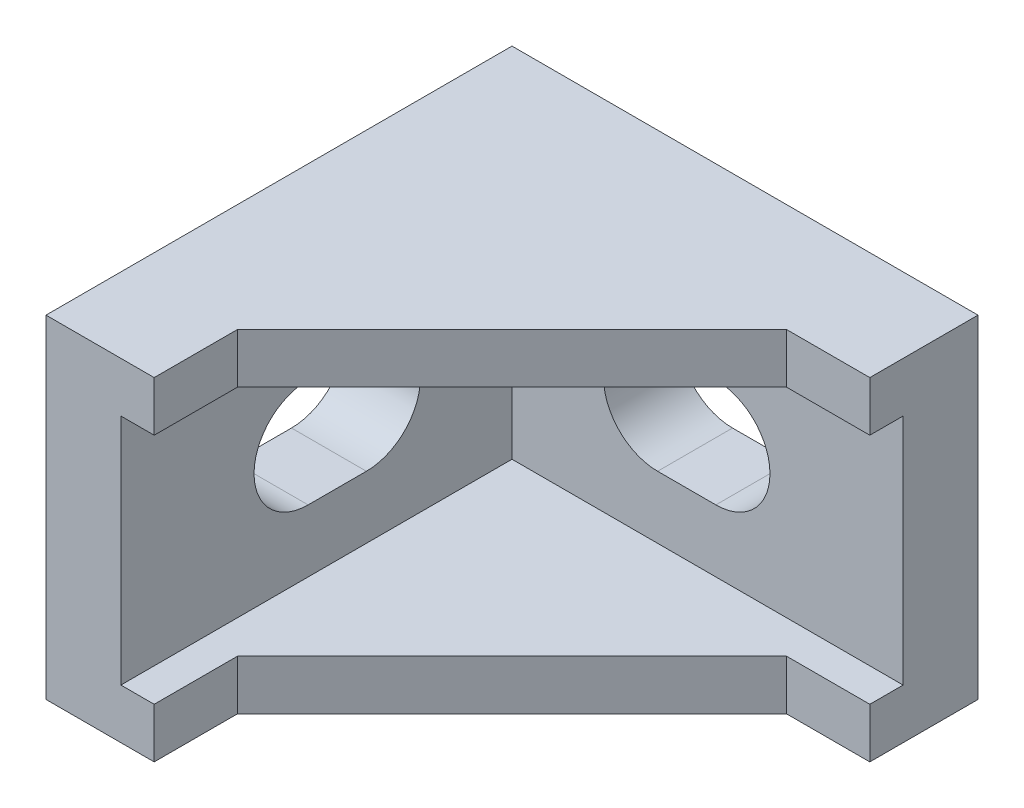
ISO-10303-21;
HEADER;
FILE_DESCRIPTION(('STEP AP214'),'2;1');
FILE_NAME('part.step','',(''),(''),'','','');
FILE_SCHEMA(('AUTOMOTIVE_DESIGN { 1 0 10303 214 1 1 1 1 }'));
ENDSEC;
DATA;
#1=APPLICATION_CONTEXT('core data for automotive mechanical design processes');
#2=APPLICATION_PROTOCOL_DEFINITION('international standard','automotive_design',2000,#1);
#3=PRODUCT_CONTEXT('',#1,'mechanical');
#4=PRODUCT('Part','Part','',(#3));
#5=PRODUCT_RELATED_PRODUCT_CATEGORY('part','',(#4));
#6=PRODUCT_DEFINITION_FORMATION('','',#4);
#7=PRODUCT_DEFINITION_CONTEXT('part definition',#1,'design');
#8=PRODUCT_DEFINITION('design','',#6,#7);
#9=PRODUCT_DEFINITION_SHAPE('','',#8);
#10=(LENGTH_UNIT() NAMED_UNIT(*) SI_UNIT(.MILLI.,.METRE.));
#11=(NAMED_UNIT(*) PLANE_ANGLE_UNIT() SI_UNIT($,.RADIAN.));
#12=(NAMED_UNIT(*) SI_UNIT($,.STERADIAN.) SOLID_ANGLE_UNIT());
#13=UNCERTAINTY_MEASURE_WITH_UNIT(LENGTH_MEASURE(1.E-05),#10,'distance_accuracy_value','');
#14=(GEOMETRIC_REPRESENTATION_CONTEXT(3) GLOBAL_UNCERTAINTY_ASSIGNED_CONTEXT((#13)) GLOBAL_UNIT_ASSIGNED_CONTEXT((#10,
#11,#12)) REPRESENTATION_CONTEXT('',''));
#15=CARTESIAN_POINT('',(0.,0.,0.));
#16=DIRECTION('',(0.,0.,1.));
#17=DIRECTION('',(1.,0.,0.));
#18=AXIS2_PLACEMENT_3D('',#15,#16,#17);
#19=CARTESIAN_POINT('',(0.,0.,4.5));
#20=DIRECTION('',(0.,0.,-1.));
#21=DIRECTION('',(-1.,0.,0.));
#22=AXIS2_PLACEMENT_3D('',#19,#20,#21);
#23=PLANE('',#22);
#24=CARTESIAN_POINT('',(-0.750000000000005,0.,4.5));
#25=DIRECTION('',(0.,0.,1.));
#26=DIRECTION('',(1.,0.,0.));
#27=AXIS2_PLACEMENT_3D('',#24,#25,#26);
#28=CIRCLE('',#27,3.25);
#29=CARTESIAN_POINT('',(-0.750000000000007,3.25,4.5));
#30=VERTEX_POINT('',#29);
#31=CARTESIAN_POINT('',(-0.750000000000006,-3.25,4.5));
#32=VERTEX_POINT('',#31);
#33=EDGE_CURVE('E245',#30,#32,#28,.T.);
#34=ORIENTED_EDGE('',*,*,#33,.F.);
#35=DIRECTION('',(-1.,0.,0.));
#36=VECTOR('',#35,1.);
#37=CARTESIAN_POINT('',(-0.750000000000007,3.25,4.5));
#38=LINE('',#37,#36);
#39=CARTESIAN_POINT('',(2.75,3.25,4.5));
#40=VERTEX_POINT('',#39);
#41=EDGE_CURVE('E253',#40,#30,#38,.T.);
#42=ORIENTED_EDGE('',*,*,#41,.F.);
#43=CARTESIAN_POINT('',(2.75,0.,4.5));
#44=DIRECTION('',(0.,0.,1.));
#45=DIRECTION('',(1.,0.,0.));
#46=AXIS2_PLACEMENT_3D('',#43,#44,#45);
#47=CIRCLE('',#46,3.25);
#48=CARTESIAN_POINT('',(2.75,-3.25,4.5));
#49=VERTEX_POINT('',#48);
#50=EDGE_CURVE('E250',#49,#40,#47,.T.);
#51=ORIENTED_EDGE('',*,*,#50,.F.);
#52=DIRECTION('',(1.,0.,0.));
#53=VECTOR('',#52,1.);
#54=CARTESIAN_POINT('',(-0.750000000000006,-3.25,4.5));
#55=LINE('',#54,#53);
#56=EDGE_CURVE('E247',#32,#49,#55,.T.);
#57=ORIENTED_EDGE('',*,*,#56,.F.);
#58=EDGE_LOOP('',(#34,#42,#51,#57));
#59=FACE_BOUND('',#58,.T.);
#60=DIRECTION('',(1.,0.,0.));
#61=VECTOR('',#60,1.);
#62=CARTESIAN_POINT('',(-9.50000000000001,7.00000000000001,4.5));
#63=LINE('',#62,#61);
#64=CARTESIAN_POINT('',(-9.50000000000001,7.00000000000001,4.5));
#65=VERTEX_POINT('',#64);
#66=CARTESIAN_POINT('',(14.,7.00000000000001,4.5));
#67=VERTEX_POINT('',#66);
#68=EDGE_CURVE('E198',#65,#67,#63,.T.);
#69=ORIENTED_EDGE('',*,*,#68,.F.);
#70=DIRECTION('',(0.,-1.,0.));
#71=VECTOR('',#70,1.);
#72=CARTESIAN_POINT('',(-9.50000000000001,12.,4.5));
#73=LINE('',#72,#71);
#74=CARTESIAN_POINT('',(-9.50000000000001,-7.00000000000001,4.5));
#75=VERTEX_POINT('',#74);
#76=EDGE_CURVE('E185',#65,#75,#73,.T.);
#77=ORIENTED_EDGE('',*,*,#76,.T.);
#78=DIRECTION('',(1.,0.,0.));
#79=VECTOR('',#78,1.);
#80=CARTESIAN_POINT('',(-9.50000000000001,-7.00000000000001,4.5));
#81=LINE('',#80,#79);
#82=CARTESIAN_POINT('',(14.,-7.00000000000001,4.5));
#83=VERTEX_POINT('',#82);
#84=EDGE_CURVE('E227',#75,#83,#81,.T.);
#85=ORIENTED_EDGE('',*,*,#84,.T.);
#86=DIRECTION('',(0.,1.,0.));
#87=VECTOR('',#86,1.);
#88=CARTESIAN_POINT('',(14.,-10.,4.5));
#89=LINE('',#88,#87);
#90=EDGE_CURVE('E48',#83,#67,#89,.T.);
#91=ORIENTED_EDGE('',*,*,#90,.T.);
#92=EDGE_LOOP('',(#69,#77,#85,#91));
#93=FACE_BOUND('',#92,.T.);
#94=ADVANCED_FACE('F33',(#59,#93),#23,.F.);
#95=CARTESIAN_POINT('',(0.,0.,0.));
#96=DIRECTION('',(0.,0.,-1.));
#97=DIRECTION('',(-1.,0.,0.));
#98=AXIS2_PLACEMENT_3D('',#95,#96,#97);
#99=PLANE('',#98);
#100=DIRECTION('',(0.,1.,0.));
#101=VECTOR('',#100,1.);
#102=CARTESIAN_POINT('',(14.,-10.,0.));
#103=LINE('',#102,#101);
#104=CARTESIAN_POINT('',(14.,-10.,0.));
#105=VERTEX_POINT('',#104);
#106=CARTESIAN_POINT('',(14.,10.,0.));
#107=VERTEX_POINT('',#106);
#108=EDGE_CURVE('E275',#105,#107,#103,.T.);
#109=ORIENTED_EDGE('',*,*,#108,.F.);
#110=DIRECTION('',(1.,0.,0.));
#111=VECTOR('',#110,1.);
#112=CARTESIAN_POINT('',(-14.,-10.,0.));
#113=LINE('',#112,#111);
#114=CARTESIAN_POINT('',(-14.,-10.,0.));
#115=VERTEX_POINT('',#114);
#116=EDGE_CURVE('E277',#115,#105,#113,.T.);
#117=ORIENTED_EDGE('',*,*,#116,.F.);
#118=DIRECTION('',(0.,-1.,0.));
#119=VECTOR('',#118,1.);
#120=CARTESIAN_POINT('',(-14.,-10.,0.));
#121=LINE('',#120,#119);
#122=CARTESIAN_POINT('',(-14.,10.,0.));
#123=VERTEX_POINT('',#122);
#124=EDGE_CURVE('E294',#123,#115,#121,.T.);
#125=ORIENTED_EDGE('',*,*,#124,.F.);
#126=DIRECTION('',(-1.,0.,0.));
#127=VECTOR('',#126,1.);
#128=CARTESIAN_POINT('',(-14.,10.,0.));
#129=LINE('',#128,#127);
#130=EDGE_CURVE('E280',#107,#123,#129,.T.);
#131=ORIENTED_EDGE('',*,*,#130,.F.);
#132=EDGE_LOOP('',(#109,#117,#125,#131));
#133=FACE_BOUND('',#132,.T.);
#134=DIRECTION('',(-1.,0.,0.));
#135=VECTOR('',#134,1.);
#136=CARTESIAN_POINT('',(-0.750000000000007,3.25,0.));
#137=LINE('',#136,#135);
#138=CARTESIAN_POINT('',(2.75,3.25,0.));
#139=VERTEX_POINT('',#138);
#140=CARTESIAN_POINT('',(-0.750000000000007,3.25,0.));
#141=VERTEX_POINT('',#140);
#142=EDGE_CURVE('E248',#139,#141,#137,.T.);
#143=ORIENTED_EDGE('',*,*,#142,.T.);
#144=CARTESIAN_POINT('',(-0.750000000000005,0.,0.));
#145=DIRECTION('',(0.,0.,1.));
#146=DIRECTION('',(1.,0.,0.));
#147=AXIS2_PLACEMENT_3D('',#144,#145,#146);
#148=CIRCLE('',#147,3.25);
#149=CARTESIAN_POINT('',(-0.750000000000006,-3.25,0.));
#150=VERTEX_POINT('',#149);
#151=EDGE_CURVE('E242',#141,#150,#148,.T.);
#152=ORIENTED_EDGE('',*,*,#151,.T.);
#153=DIRECTION('',(1.,0.,0.));
#154=VECTOR('',#153,1.);
#155=CARTESIAN_POINT('',(-0.750000000000006,-3.25,0.));
#156=LINE('',#155,#154);
#157=CARTESIAN_POINT('',(2.75,-3.25,0.));
#158=VERTEX_POINT('',#157);
#159=EDGE_CURVE('E258',#150,#158,#156,.T.);
#160=ORIENTED_EDGE('',*,*,#159,.T.);
#161=CARTESIAN_POINT('',(2.75,0.,0.));
#162=DIRECTION('',(0.,0.,1.));
#163=DIRECTION('',(1.,0.,0.));
#164=AXIS2_PLACEMENT_3D('',#161,#162,#163);
#165=CIRCLE('',#164,3.25);
#166=EDGE_CURVE('E261',#158,#139,#165,.T.);
#167=ORIENTED_EDGE('',*,*,#166,.T.);
#168=EDGE_LOOP('',(#143,#152,#160,#167));
#169=FACE_BOUND('',#168,.T.);
#170=ADVANCED_FACE('F290',(#133,#169),#99,.T.);
#171=CARTESIAN_POINT('',(14.,-10.,4.5));
#172=DIRECTION('',(-1.,0.,0.));
#173=DIRECTION('',(0.,-1.,0.));
#174=AXIS2_PLACEMENT_3D('',#171,#172,#173);
#175=PLANE('',#174);
#176=ORIENTED_EDGE('',*,*,#108,.T.);
#177=DIRECTION('',(0.,0.,-1.));
#178=VECTOR('',#177,1.);
#179=CARTESIAN_POINT('',(14.,10.,4.5));
#180=LINE('',#179,#178);
#181=CARTESIAN_POINT('',(14.,10.,6.5));
#182=VERTEX_POINT('',#181);
#183=EDGE_CURVE('E11',#182,#107,#180,.T.);
#184=ORIENTED_EDGE('',*,*,#183,.F.);
#185=DIRECTION('',(0.,1.,0.));
#186=VECTOR('',#185,1.);
#187=CARTESIAN_POINT('',(14.,7.00000000000001,6.5));
#188=LINE('',#187,#186);
#189=CARTESIAN_POINT('',(14.,7.00000000000001,6.5));
#190=VERTEX_POINT('',#189);
#191=EDGE_CURVE('E221',#190,#182,#188,.T.);
#192=ORIENTED_EDGE('',*,*,#191,.F.);
#193=DIRECTION('',(0.,0.,1.));
#194=VECTOR('',#193,1.);
#195=CARTESIAN_POINT('',(14.,7.00000000000001,4.5));
#196=LINE('',#195,#194);
#197=EDGE_CURVE('E217',#67,#190,#196,.T.);
#198=ORIENTED_EDGE('',*,*,#197,.F.);
#199=ORIENTED_EDGE('',*,*,#90,.F.);
#200=DIRECTION('',(0.,0.,1.));
#201=VECTOR('',#200,1.);
#202=CARTESIAN_POINT('',(14.,-7.00000000000001,4.5));
#203=LINE('',#202,#201);
#204=CARTESIAN_POINT('',(14.,-7.00000000000001,6.5));
#205=VERTEX_POINT('',#204);
#206=EDGE_CURVE('E56',#83,#205,#203,.T.);
#207=ORIENTED_EDGE('',*,*,#206,.T.);
#208=DIRECTION('',(0.,-1.,0.));
#209=VECTOR('',#208,1.);
#210=CARTESIAN_POINT('',(14.,-7.00000000000001,6.5));
#211=LINE('',#210,#209);
#212=CARTESIAN_POINT('',(14.,-10.,6.5));
#213=VERTEX_POINT('',#212);
#214=EDGE_CURVE('E236',#205,#213,#211,.T.);
#215=ORIENTED_EDGE('',*,*,#214,.T.);
#216=DIRECTION('',(0.,0.,-1.));
#217=VECTOR('',#216,1.);
#218=CARTESIAN_POINT('',(14.,-10.,4.5));
#219=LINE('',#218,#217);
#220=EDGE_CURVE('E41',#213,#105,#219,.T.);
#221=ORIENTED_EDGE('',*,*,#220,.T.);
#222=EDGE_LOOP('',(#176,#184,#192,#198,#199,#207,#215,#221));
#223=FACE_BOUND('',#222,.T.);
#224=ADVANCED_FACE('F35',(#223),#175,.F.);
#225=CARTESIAN_POINT('',(-14.,10.,4.5));
#226=DIRECTION('',(0.,-1.,0.));
#227=DIRECTION('',(1.,0.,0.));
#228=AXIS2_PLACEMENT_3D('',#225,#226,#227);
#229=PLANE('',#228);
#230=ORIENTED_EDGE('',*,*,#130,.T.);
#231=DIRECTION('',(0.,0.,-1.));
#232=VECTOR('',#231,1.);
#233=CARTESIAN_POINT('',(-14.,10.,0.));
#234=LINE('',#233,#232);
#235=CARTESIAN_POINT('',(-14.,10.,28.));
#236=VERTEX_POINT('',#235);
#237=EDGE_CURVE('E377',#236,#123,#234,.T.);
#238=ORIENTED_EDGE('',*,*,#237,.F.);
#239=DIRECTION('',(-1.,0.,0.));
#240=VECTOR('',#239,1.);
#241=CARTESIAN_POINT('',(-9.50000000000002,10.,28.));
#242=LINE('',#241,#240);
#243=CARTESIAN_POINT('',(-7.50000000000002,10.,28.));
#244=VERTEX_POINT('',#243);
#245=EDGE_CURVE('E213',#244,#236,#242,.T.);
#246=ORIENTED_EDGE('',*,*,#245,.F.);
#247=DIRECTION('',(0.,0.,-1.));
#248=VECTOR('',#247,1.);
#249=CARTESIAN_POINT('',(-7.50000000000002,10.,28.));
#250=LINE('',#249,#248);
#251=CARTESIAN_POINT('',(-7.50000000000002,10.,23.));
#252=VERTEX_POINT('',#251);
#253=EDGE_CURVE('E203',#244,#252,#250,.T.);
#254=ORIENTED_EDGE('',*,*,#253,.T.);
#255=DIRECTION('',(-0.707106781186556,0.,0.707106781186539));
#256=VECTOR('',#255,1.);
#257=CARTESIAN_POINT('',(8.99999999999999,10.,6.5));
#258=LINE('',#257,#256);
#259=CARTESIAN_POINT('',(8.99999999999999,10.,6.5));
#260=VERTEX_POINT('',#259);
#261=EDGE_CURVE('E210',#260,#252,#258,.T.);
#262=ORIENTED_EDGE('',*,*,#261,.F.);
#263=DIRECTION('',(-1.,0.,0.));
#264=VECTOR('',#263,1.);
#265=CARTESIAN_POINT('',(14.,10.,6.5));
#266=LINE('',#265,#264);
#267=EDGE_CURVE('E206',#182,#260,#266,.T.);
#268=ORIENTED_EDGE('',*,*,#267,.F.);
#269=ORIENTED_EDGE('',*,*,#183,.T.);
#270=EDGE_LOOP('',(#230,#238,#246,#254,#262,#268,#269));
#271=FACE_BOUND('',#270,.T.);
#272=ADVANCED_FACE('F298',(#271),#229,.F.);
#273=CARTESIAN_POINT('',(-14.,-10.,4.5));
#274=DIRECTION('',(0.,1.,0.));
#275=DIRECTION('',(0.,0.,1.));
#276=AXIS2_PLACEMENT_3D('',#273,#274,#275);
#277=PLANE('',#276);
#278=ORIENTED_EDGE('',*,*,#220,.F.);
#279=DIRECTION('',(-1.,0.,0.));
#280=VECTOR('',#279,1.);
#281=CARTESIAN_POINT('',(14.,-10.,6.5));
#282=LINE('',#281,#280);
#283=CARTESIAN_POINT('',(8.99999999999999,-10.,6.5));
#284=VERTEX_POINT('',#283);
#285=EDGE_CURVE('E224',#213,#284,#282,.T.);
#286=ORIENTED_EDGE('',*,*,#285,.T.);
#287=DIRECTION('',(-0.707106781186556,0.,0.707106781186539));
#288=VECTOR('',#287,1.);
#289=CARTESIAN_POINT('',(8.99999999999999,-10.,6.5));
#290=LINE('',#289,#288);
#291=CARTESIAN_POINT('',(-7.50000000000002,-10.,23.));
#292=VERTEX_POINT('',#291);
#293=EDGE_CURVE('E229',#284,#292,#290,.T.);
#294=ORIENTED_EDGE('',*,*,#293,.T.);
#295=DIRECTION('',(0.,0.,-1.));
#296=VECTOR('',#295,1.);
#297=CARTESIAN_POINT('',(-7.50000000000002,-10.,28.));
#298=LINE('',#297,#296);
#299=CARTESIAN_POINT('',(-7.50000000000002,-10.,28.));
#300=VERTEX_POINT('',#299);
#301=EDGE_CURVE('E323',#300,#292,#298,.T.);
#302=ORIENTED_EDGE('',*,*,#301,.F.);
#303=DIRECTION('',(-1.,0.,0.));
#304=VECTOR('',#303,1.);
#305=CARTESIAN_POINT('',(-9.50000000000002,-10.,28.));
#306=LINE('',#305,#304);
#307=CARTESIAN_POINT('',(-14.,-10.,28.));
#308=VERTEX_POINT('',#307);
#309=EDGE_CURVE('E373',#300,#308,#306,.T.);
#310=ORIENTED_EDGE('',*,*,#309,.T.);
#311=DIRECTION('',(0.,0.,1.));
#312=VECTOR('',#311,1.);
#313=CARTESIAN_POINT('',(-14.,-10.,0.));
#314=LINE('',#313,#312);
#315=EDGE_CURVE('E374',#115,#308,#314,.T.);
#316=ORIENTED_EDGE('',*,*,#315,.F.);
#317=ORIENTED_EDGE('',*,*,#116,.T.);
#318=EDGE_LOOP('',(#278,#286,#294,#302,#310,#316,#317));
#319=FACE_BOUND('',#318,.T.);
#320=ADVANCED_FACE('F389',(#319),#277,.F.);
#321=CARTESIAN_POINT('',(-0.750000000000005,0.,4.5));
#322=DIRECTION('',(0.,0.,-1.));
#323=DIRECTION('',(-1.,0.,0.));
#324=AXIS2_PLACEMENT_3D('',#321,#322,#323);
#325=CYLINDRICAL_SURFACE('',#324,3.25);
#326=ORIENTED_EDGE('',*,*,#151,.F.);
#327=DIRECTION('',(0.,0.,-1.));
#328=VECTOR('',#327,1.);
#329=CARTESIAN_POINT('',(-0.750000000000007,3.25,4.5));
#330=LINE('',#329,#328);
#331=EDGE_CURVE('E255',#30,#141,#330,.T.);
#332=ORIENTED_EDGE('',*,*,#331,.F.);
#333=ORIENTED_EDGE('',*,*,#33,.T.);
#334=DIRECTION('',(0.,0.,-1.));
#335=VECTOR('',#334,1.);
#336=CARTESIAN_POINT('',(-0.750000000000006,-3.25,4.5));
#337=LINE('',#336,#335);
#338=EDGE_CURVE('E272',#32,#150,#337,.T.);
#339=ORIENTED_EDGE('',*,*,#338,.T.);
#340=EDGE_LOOP('',(#326,#332,#333,#339));
#341=FACE_BOUND('',#340,.T.);
#342=ADVANCED_FACE('F391',(#341),#325,.F.);
#343=CARTESIAN_POINT('',(-0.750000000000006,-3.25,4.5));
#344=DIRECTION('',(0.,1.,0.));
#345=DIRECTION('',(-1.,0.,0.));
#346=AXIS2_PLACEMENT_3D('',#343,#344,#345);
#347=PLANE('',#346);
#348=ORIENTED_EDGE('',*,*,#159,.F.);
#349=ORIENTED_EDGE('',*,*,#338,.F.);
#350=ORIENTED_EDGE('',*,*,#56,.T.);
#351=DIRECTION('',(0.,0.,-1.));
#352=VECTOR('',#351,1.);
#353=CARTESIAN_POINT('',(2.75,-3.25,4.5));
#354=LINE('',#353,#352);
#355=EDGE_CURVE('E270',#49,#158,#354,.T.);
#356=ORIENTED_EDGE('',*,*,#355,.T.);
#357=EDGE_LOOP('',(#348,#349,#350,#356));
#358=FACE_BOUND('',#357,.T.);
#359=ADVANCED_FACE('F397',(#358),#347,.T.);
#360=CARTESIAN_POINT('',(2.75,0.,4.5));
#361=DIRECTION('',(0.,0.,-1.));
#362=DIRECTION('',(-1.,0.,0.));
#363=AXIS2_PLACEMENT_3D('',#360,#361,#362);
#364=CYLINDRICAL_SURFACE('',#363,3.25);
#365=ORIENTED_EDGE('',*,*,#166,.F.);
#366=ORIENTED_EDGE('',*,*,#355,.F.);
#367=ORIENTED_EDGE('',*,*,#50,.T.);
#368=DIRECTION('',(0.,0.,-1.));
#369=VECTOR('',#368,1.);
#370=CARTESIAN_POINT('',(2.75,3.25,4.5));
#371=LINE('',#370,#369);
#372=EDGE_CURVE('E268',#40,#139,#371,.T.);
#373=ORIENTED_EDGE('',*,*,#372,.T.);
#374=EDGE_LOOP('',(#365,#366,#367,#373));
#375=FACE_BOUND('',#374,.T.);
#376=ADVANCED_FACE('F411',(#375),#364,.F.);
#377=CARTESIAN_POINT('',(-0.750000000000007,3.25,4.5));
#378=DIRECTION('',(0.,-1.,0.));
#379=DIRECTION('',(1.,0.,0.));
#380=AXIS2_PLACEMENT_3D('',#377,#378,#379);
#381=PLANE('',#380);
#382=ORIENTED_EDGE('',*,*,#142,.F.);
#383=ORIENTED_EDGE('',*,*,#372,.F.);
#384=ORIENTED_EDGE('',*,*,#41,.T.);
#385=ORIENTED_EDGE('',*,*,#331,.T.);
#386=EDGE_LOOP('',(#382,#383,#384,#385));
#387=FACE_BOUND('',#386,.T.);
#388=ADVANCED_FACE('F415',(#387),#381,.T.);
#389=CARTESIAN_POINT('',(8.99999999999999,-7.00000000000001,6.5));
#390=DIRECTION('',(0.707106781186539,0.,0.707106781186556));
#391=DIRECTION('',(0.707106781186556,0.,-0.707106781186539));
#392=AXIS2_PLACEMENT_3D('',#389,#390,#391);
#393=PLANE('',#392);
#394=ORIENTED_EDGE('',*,*,#293,.F.);
#395=DIRECTION('',(0.,-1.,0.));
#396=VECTOR('',#395,1.);
#397=CARTESIAN_POINT('',(8.99999999999999,-7.00000000000001,6.5));
#398=LINE('',#397,#396);
#399=CARTESIAN_POINT('',(8.99999999999999,-7.00000000000001,6.5));
#400=VERTEX_POINT('',#399);
#401=EDGE_CURVE('E240',#400,#284,#398,.T.);
#402=ORIENTED_EDGE('',*,*,#401,.F.);
#403=DIRECTION('',(-0.707106781186556,0.,0.707106781186539));
#404=VECTOR('',#403,1.);
#405=CARTESIAN_POINT('',(8.99999999999999,-7.00000000000001,6.5));
#406=LINE('',#405,#404);
#407=CARTESIAN_POINT('',(-7.50000000000002,-7.00000000000001,23.));
#408=VERTEX_POINT('',#407);
#409=EDGE_CURVE('E234',#400,#408,#406,.T.);
#410=ORIENTED_EDGE('',*,*,#409,.T.);
#411=DIRECTION('',(0.,-1.,0.));
#412=VECTOR('',#411,1.);
#413=CARTESIAN_POINT('',(-7.50000000000002,-7.00000000000001,23.));
#414=LINE('',#413,#412);
#415=EDGE_CURVE('E193',#408,#292,#414,.T.);
#416=ORIENTED_EDGE('',*,*,#415,.T.);
#417=EDGE_LOOP('',(#394,#402,#410,#416));
#418=FACE_BOUND('',#417,.T.);
#419=ADVANCED_FACE('F419',(#418),#393,.T.);
#420=CARTESIAN_POINT('',(14.,-7.00000000000001,6.5));
#421=DIRECTION('',(0.,0.,1.));
#422=DIRECTION('',(1.,0.,0.));
#423=AXIS2_PLACEMENT_3D('',#420,#421,#422);
#424=PLANE('',#423);
#425=ORIENTED_EDGE('',*,*,#285,.F.);
#426=ORIENTED_EDGE('',*,*,#214,.F.);
#427=DIRECTION('',(-1.,0.,0.));
#428=VECTOR('',#427,1.);
#429=CARTESIAN_POINT('',(14.,-7.00000000000001,6.5));
#430=LINE('',#429,#428);
#431=EDGE_CURVE('E231',#205,#400,#430,.T.);
#432=ORIENTED_EDGE('',*,*,#431,.T.);
#433=ORIENTED_EDGE('',*,*,#401,.T.);
#434=EDGE_LOOP('',(#425,#426,#432,#433));
#435=FACE_BOUND('',#434,.T.);
#436=ADVANCED_FACE('F421',(#435),#424,.T.);
#437=CARTESIAN_POINT('',(0.,-7.00000000000001,0.));
#438=DIRECTION('',(0.,-1.,0.));
#439=DIRECTION('',(0.,0.,-1.));
#440=AXIS2_PLACEMENT_3D('',#437,#438,#439);
#441=PLANE('',#440);
#442=ORIENTED_EDGE('',*,*,#84,.F.);
#443=DIRECTION('',(0.,0.,1.));
#444=VECTOR('',#443,1.);
#445=CARTESIAN_POINT('',(-9.50000000000001,-7.00000000000001,4.5));
#446=LINE('',#445,#444);
#447=CARTESIAN_POINT('',(-9.50000000000002,-7.00000000000001,28.));
#448=VERTEX_POINT('',#447);
#449=EDGE_CURVE('E191',#75,#448,#446,.T.);
#450=ORIENTED_EDGE('',*,*,#449,.T.);
#451=DIRECTION('',(1.,0.,0.));
#452=VECTOR('',#451,1.);
#453=CARTESIAN_POINT('',(-9.50000000000002,-7.00000000000001,28.));
#454=LINE('',#453,#452);
#455=CARTESIAN_POINT('',(-7.50000000000002,-7.00000000000001,28.));
#456=VERTEX_POINT('',#455);
#457=EDGE_CURVE('E326',#448,#456,#454,.T.);
#458=ORIENTED_EDGE('',*,*,#457,.T.);
#459=DIRECTION('',(0.,0.,-1.));
#460=VECTOR('',#459,1.);
#461=CARTESIAN_POINT('',(-7.50000000000002,-7.00000000000001,28.));
#462=LINE('',#461,#460);
#463=EDGE_CURVE('E329',#456,#408,#462,.T.);
#464=ORIENTED_EDGE('',*,*,#463,.T.);
#465=ORIENTED_EDGE('',*,*,#409,.F.);
#466=ORIENTED_EDGE('',*,*,#431,.F.);
#467=ORIENTED_EDGE('',*,*,#206,.F.);
#468=EDGE_LOOP('',(#442,#450,#458,#464,#465,#466,#467));
#469=FACE_BOUND('',#468,.T.);
#470=ADVANCED_FACE('F424',(#469),#441,.F.);
#471=CARTESIAN_POINT('',(14.,7.00000000000001,6.5));
#472=DIRECTION('',(0.,0.,-1.));
#473=DIRECTION('',(-1.,0.,0.));
#474=AXIS2_PLACEMENT_3D('',#471,#472,#473);
#475=PLANE('',#474);
#476=ORIENTED_EDGE('',*,*,#267,.T.);
#477=DIRECTION('',(0.,1.,0.));
#478=VECTOR('',#477,1.);
#479=CARTESIAN_POINT('',(8.99999999999999,7.00000000000001,6.5));
#480=LINE('',#479,#478);
#481=CARTESIAN_POINT('',(8.99999999999999,7.00000000000001,6.5));
#482=VERTEX_POINT('',#481);
#483=EDGE_CURVE('E219',#482,#260,#480,.T.);
#484=ORIENTED_EDGE('',*,*,#483,.F.);
#485=DIRECTION('',(-1.,0.,0.));
#486=VECTOR('',#485,1.);
#487=CARTESIAN_POINT('',(14.,7.00000000000001,6.5));
#488=LINE('',#487,#486);
#489=EDGE_CURVE('E208',#190,#482,#488,.T.);
#490=ORIENTED_EDGE('',*,*,#489,.F.);
#491=ORIENTED_EDGE('',*,*,#191,.T.);
#492=EDGE_LOOP('',(#476,#484,#490,#491));
#493=FACE_BOUND('',#492,.T.);
#494=ADVANCED_FACE('F303',(#493),#475,.F.);
#495=CARTESIAN_POINT('',(8.99999999999999,7.00000000000001,6.5));
#496=DIRECTION('',(-0.707106781186539,0.,-0.707106781186556));
#497=DIRECTION('',(-0.707106781186556,0.,0.707106781186539));
#498=AXIS2_PLACEMENT_3D('',#495,#496,#497);
#499=PLANE('',#498);
#500=ORIENTED_EDGE('',*,*,#261,.T.);
#501=DIRECTION('',(0.,1.,0.));
#502=VECTOR('',#501,1.);
#503=CARTESIAN_POINT('',(-7.50000000000002,7.00000000000001,23.));
#504=LINE('',#503,#502);
#505=CARTESIAN_POINT('',(-7.50000000000002,7.00000000000001,23.));
#506=VERTEX_POINT('',#505);
#507=EDGE_CURVE('E311',#506,#252,#504,.T.);
#508=ORIENTED_EDGE('',*,*,#507,.F.);
#509=DIRECTION('',(-0.707106781186556,0.,0.707106781186539));
#510=VECTOR('',#509,1.);
#511=CARTESIAN_POINT('',(8.99999999999999,7.00000000000001,6.5));
#512=LINE('',#511,#510);
#513=EDGE_CURVE('E205',#482,#506,#512,.T.);
#514=ORIENTED_EDGE('',*,*,#513,.F.);
#515=ORIENTED_EDGE('',*,*,#483,.T.);
#516=EDGE_LOOP('',(#500,#508,#514,#515));
#517=FACE_BOUND('',#516,.T.);
#518=ADVANCED_FACE('F312',(#517),#499,.F.);
#519=CARTESIAN_POINT('',(0.,7.00000000000001,0.));
#520=DIRECTION('',(0.,1.,0.));
#521=DIRECTION('',(0.,0.,-1.));
#522=AXIS2_PLACEMENT_3D('',#519,#520,#521);
#523=PLANE('',#522);
#524=ORIENTED_EDGE('',*,*,#68,.T.);
#525=ORIENTED_EDGE('',*,*,#197,.T.);
#526=ORIENTED_EDGE('',*,*,#489,.T.);
#527=ORIENTED_EDGE('',*,*,#513,.T.);
#528=DIRECTION('',(0.,0.,-1.));
#529=VECTOR('',#528,1.);
#530=CARTESIAN_POINT('',(-7.50000000000002,7.00000000000001,28.));
#531=LINE('',#530,#529);
#532=CARTESIAN_POINT('',(-7.50000000000002,7.00000000000001,28.));
#533=VERTEX_POINT('',#532);
#534=EDGE_CURVE('E202',#533,#506,#531,.T.);
#535=ORIENTED_EDGE('',*,*,#534,.F.);
#536=DIRECTION('',(1.,0.,0.));
#537=VECTOR('',#536,1.);
#538=CARTESIAN_POINT('',(-9.50000000000002,7.00000000000001,28.));
#539=LINE('',#538,#537);
#540=CARTESIAN_POINT('',(-9.50000000000002,7.00000000000001,28.));
#541=VERTEX_POINT('',#540);
#542=EDGE_CURVE('E200',#541,#533,#539,.T.);
#543=ORIENTED_EDGE('',*,*,#542,.F.);
#544=DIRECTION('',(0.,0.,1.));
#545=VECTOR('',#544,1.);
#546=CARTESIAN_POINT('',(-9.50000000000001,7.00000000000001,4.5));
#547=LINE('',#546,#545);
#548=EDGE_CURVE('E189',#65,#541,#547,.T.);
#549=ORIENTED_EDGE('',*,*,#548,.F.);
#550=EDGE_LOOP('',(#524,#525,#526,#527,#535,#543,#549));
#551=FACE_BOUND('',#550,.T.);
#552=ADVANCED_FACE('F197',(#551),#523,.F.);
#553=CARTESIAN_POINT('',(-9.50000000000002,0.,14.));
#554=DIRECTION('',(-1.,0.,0.));
#555=DIRECTION('',(0.,0.,-1.));
#556=AXIS2_PLACEMENT_3D('',#553,#554,#555);
#557=PLANE('',#556);
#558=CARTESIAN_POINT('',(-9.50000000000002,0.,13.25));
#559=DIRECTION('',(-1.,0.,0.));
#560=DIRECTION('',(0.,0.,1.));
#561=AXIS2_PLACEMENT_3D('',#558,#559,#560);
#562=CIRCLE('',#561,3.25);
#563=CARTESIAN_POINT('',(-9.50000000000002,3.25,13.25));
#564=VERTEX_POINT('',#563);
#565=CARTESIAN_POINT('',(-9.50000000000002,-3.25,13.25));
#566=VERTEX_POINT('',#565);
#567=EDGE_CURVE('E339',#564,#566,#562,.T.);
#568=ORIENTED_EDGE('',*,*,#567,.T.);
#569=DIRECTION('',(0.,0.,1.));
#570=VECTOR('',#569,1.);
#571=CARTESIAN_POINT('',(-9.50000000000002,-3.25,13.25));
#572=LINE('',#571,#570);
#573=CARTESIAN_POINT('',(-9.50000000000002,-3.25,16.75));
#574=VERTEX_POINT('',#573);
#575=EDGE_CURVE('E342',#566,#574,#572,.T.);
#576=ORIENTED_EDGE('',*,*,#575,.T.);
#577=CARTESIAN_POINT('',(-9.50000000000002,0.,16.75));
#578=DIRECTION('',(-1.,0.,0.));
#579=DIRECTION('',(0.,0.,1.));
#580=AXIS2_PLACEMENT_3D('',#577,#578,#579);
#581=CIRCLE('',#580,3.25);
#582=CARTESIAN_POINT('',(-9.50000000000002,3.25,16.75));
#583=VERTEX_POINT('',#582);
#584=EDGE_CURVE('E346',#574,#583,#581,.T.);
#585=ORIENTED_EDGE('',*,*,#584,.T.);
#586=DIRECTION('',(0.,0.,-1.));
#587=VECTOR('',#586,1.);
#588=CARTESIAN_POINT('',(-9.50000000000002,3.25,13.25));
#589=LINE('',#588,#587);
#590=EDGE_CURVE('E349',#583,#564,#589,.T.);
#591=ORIENTED_EDGE('',*,*,#590,.T.);
#592=EDGE_LOOP('',(#568,#576,#585,#591));
#593=FACE_BOUND('',#592,.T.);
#594=ORIENTED_EDGE('',*,*,#548,.T.);
#595=DIRECTION('',(0.,1.,0.));
#596=VECTOR('',#595,1.);
#597=CARTESIAN_POINT('',(-9.50000000000002,-10.,28.));
#598=LINE('',#597,#596);
#599=EDGE_CURVE('E371',#448,#541,#598,.T.);
#600=ORIENTED_EDGE('',*,*,#599,.F.);
#601=ORIENTED_EDGE('',*,*,#449,.F.);
#602=ORIENTED_EDGE('',*,*,#76,.F.);
#603=EDGE_LOOP('',(#594,#600,#601,#602));
#604=FACE_BOUND('',#603,.T.);
#605=ADVANCED_FACE('F187',(#593,#604),#557,.F.);
#606=CARTESIAN_POINT('',(-14.,0.,14.));
#607=DIRECTION('',(-1.,0.,0.));
#608=DIRECTION('',(0.,0.,-1.));
#609=AXIS2_PLACEMENT_3D('',#606,#607,#608);
#610=PLANE('',#609);
#611=DIRECTION('',(0.,1.,0.));
#612=VECTOR('',#611,1.);
#613=CARTESIAN_POINT('',(-14.,-10.,28.));
#614=LINE('',#613,#612);
#615=EDGE_CURVE('E370',#308,#236,#614,.T.);
#616=ORIENTED_EDGE('',*,*,#615,.T.);
#617=ORIENTED_EDGE('',*,*,#237,.T.);
#618=ORIENTED_EDGE('',*,*,#124,.T.);
#619=ORIENTED_EDGE('',*,*,#315,.T.);
#620=EDGE_LOOP('',(#616,#617,#618,#619));
#621=FACE_BOUND('',#620,.T.);
#622=DIRECTION('',(0.,0.,-1.));
#623=VECTOR('',#622,1.);
#624=CARTESIAN_POINT('',(-14.,3.25,13.25));
#625=LINE('',#624,#623);
#626=CARTESIAN_POINT('',(-14.,3.25,16.75));
#627=VERTEX_POINT('',#626);
#628=CARTESIAN_POINT('',(-14.,3.25,13.25));
#629=VERTEX_POINT('',#628);
#630=EDGE_CURVE('E343',#627,#629,#625,.T.);
#631=ORIENTED_EDGE('',*,*,#630,.F.);
#632=CARTESIAN_POINT('',(-14.,0.,16.75));
#633=DIRECTION('',(-1.,0.,0.));
#634=DIRECTION('',(0.,0.,1.));
#635=AXIS2_PLACEMENT_3D('',#632,#633,#634);
#636=CIRCLE('',#635,3.25);
#637=CARTESIAN_POINT('',(-14.,-3.25,16.75));
#638=VERTEX_POINT('',#637);
#639=EDGE_CURVE('E358',#638,#627,#636,.T.);
#640=ORIENTED_EDGE('',*,*,#639,.F.);
#641=DIRECTION('',(0.,0.,1.));
#642=VECTOR('',#641,1.);
#643=CARTESIAN_POINT('',(-14.,-3.25,13.25));
#644=LINE('',#643,#642);
#645=CARTESIAN_POINT('',(-14.,-3.25,13.25));
#646=VERTEX_POINT('',#645);
#647=EDGE_CURVE('E355',#646,#638,#644,.T.);
#648=ORIENTED_EDGE('',*,*,#647,.F.);
#649=CARTESIAN_POINT('',(-14.,0.,13.25));
#650=DIRECTION('',(-1.,0.,0.));
#651=DIRECTION('',(0.,0.,1.));
#652=AXIS2_PLACEMENT_3D('',#649,#650,#651);
#653=CIRCLE('',#652,3.25);
#654=EDGE_CURVE('E192',#629,#646,#653,.T.);
#655=ORIENTED_EDGE('',*,*,#654,.F.);
#656=EDGE_LOOP('',(#631,#640,#648,#655));
#657=FACE_BOUND('',#656,.T.);
#658=ADVANCED_FACE('F387',(#621,#657),#610,.T.);
#659=CARTESIAN_POINT('',(-9.50000000000002,-10.,28.));
#660=DIRECTION('',(0.,0.,-1.));
#661=DIRECTION('',(0.,-1.,0.));
#662=AXIS2_PLACEMENT_3D('',#659,#660,#661);
#663=PLANE('',#662);
#664=ORIENTED_EDGE('',*,*,#615,.F.);
#665=ORIENTED_EDGE('',*,*,#309,.F.);
#666=DIRECTION('',(0.,-1.,0.));
#667=VECTOR('',#666,1.);
#668=CARTESIAN_POINT('',(-7.50000000000002,-7.00000000000001,28.));
#669=LINE('',#668,#667);
#670=EDGE_CURVE('E332',#456,#300,#669,.T.);
#671=ORIENTED_EDGE('',*,*,#670,.F.);
#672=ORIENTED_EDGE('',*,*,#457,.F.);
#673=ORIENTED_EDGE('',*,*,#599,.T.);
#674=ORIENTED_EDGE('',*,*,#542,.T.);
#675=DIRECTION('',(0.,1.,0.));
#676=VECTOR('',#675,1.);
#677=CARTESIAN_POINT('',(-7.50000000000002,7.00000000000001,28.));
#678=LINE('',#677,#676);
#679=EDGE_CURVE('E315',#533,#244,#678,.T.);
#680=ORIENTED_EDGE('',*,*,#679,.T.);
#681=ORIENTED_EDGE('',*,*,#245,.T.);
#682=EDGE_LOOP('',(#664,#665,#671,#672,#673,#674,#680,#681));
#683=FACE_BOUND('',#682,.T.);
#684=ADVANCED_FACE('F385',(#683),#663,.F.);
#685=CARTESIAN_POINT('',(-9.50000000000002,0.,13.25));
#686=DIRECTION('',(-1.,0.,0.));
#687=DIRECTION('',(0.,0.,-1.));
#688=AXIS2_PLACEMENT_3D('',#685,#686,#687);
#689=CYLINDRICAL_SURFACE('',#688,3.25);
#690=ORIENTED_EDGE('',*,*,#654,.T.);
#691=DIRECTION('',(-1.,0.,0.));
#692=VECTOR('',#691,1.);
#693=CARTESIAN_POINT('',(-9.50000000000002,-3.25,13.25));
#694=LINE('',#693,#692);
#695=EDGE_CURVE('E368',#566,#646,#694,.T.);
#696=ORIENTED_EDGE('',*,*,#695,.F.);
#697=ORIENTED_EDGE('',*,*,#567,.F.);
#698=DIRECTION('',(-1.,0.,0.));
#699=VECTOR('',#698,1.);
#700=CARTESIAN_POINT('',(-9.50000000000002,3.25,13.25));
#701=LINE('',#700,#699);
#702=EDGE_CURVE('E352',#564,#629,#701,.T.);
#703=ORIENTED_EDGE('',*,*,#702,.T.);
#704=EDGE_LOOP('',(#690,#696,#697,#703));
#705=FACE_BOUND('',#704,.T.);
#706=ADVANCED_FACE('F439',(#705),#689,.F.);
#707=CARTESIAN_POINT('',(-9.50000000000002,-3.25,13.25));
#708=DIRECTION('',(0.,1.,0.));
#709=DIRECTION('',(0.,0.,-1.));
#710=AXIS2_PLACEMENT_3D('',#707,#708,#709);
#711=PLANE('',#710);
#712=ORIENTED_EDGE('',*,*,#647,.T.);
#713=DIRECTION('',(-1.,0.,0.));
#714=VECTOR('',#713,1.);
#715=CARTESIAN_POINT('',(-9.50000000000002,-3.25,16.75));
#716=LINE('',#715,#714);
#717=EDGE_CURVE('E366',#574,#638,#716,.T.);
#718=ORIENTED_EDGE('',*,*,#717,.F.);
#719=ORIENTED_EDGE('',*,*,#575,.F.);
#720=ORIENTED_EDGE('',*,*,#695,.T.);
#721=EDGE_LOOP('',(#712,#718,#719,#720));
#722=FACE_BOUND('',#721,.T.);
#723=ADVANCED_FACE('F447',(#722),#711,.T.);
#724=CARTESIAN_POINT('',(-9.50000000000002,0.,16.75));
#725=DIRECTION('',(-1.,0.,0.));
#726=DIRECTION('',(0.,0.,-1.));
#727=AXIS2_PLACEMENT_3D('',#724,#725,#726);
#728=CYLINDRICAL_SURFACE('',#727,3.25);
#729=ORIENTED_EDGE('',*,*,#639,.T.);
#730=DIRECTION('',(-1.,0.,0.));
#731=VECTOR('',#730,1.);
#732=CARTESIAN_POINT('',(-9.50000000000002,3.25,16.75));
#733=LINE('',#732,#731);
#734=EDGE_CURVE('E364',#583,#627,#733,.T.);
#735=ORIENTED_EDGE('',*,*,#734,.F.);
#736=ORIENTED_EDGE('',*,*,#584,.F.);
#737=ORIENTED_EDGE('',*,*,#717,.T.);
#738=EDGE_LOOP('',(#729,#735,#736,#737));
#739=FACE_BOUND('',#738,.T.);
#740=ADVANCED_FACE('F451',(#739),#728,.F.);
#741=CARTESIAN_POINT('',(-9.50000000000002,3.25,13.25));
#742=DIRECTION('',(0.,-1.,0.));
#743=DIRECTION('',(0.,0.,1.));
#744=AXIS2_PLACEMENT_3D('',#741,#742,#743);
#745=PLANE('',#744);
#746=ORIENTED_EDGE('',*,*,#630,.T.);
#747=ORIENTED_EDGE('',*,*,#702,.F.);
#748=ORIENTED_EDGE('',*,*,#590,.F.);
#749=ORIENTED_EDGE('',*,*,#734,.T.);
#750=EDGE_LOOP('',(#746,#747,#748,#749));
#751=FACE_BOUND('',#750,.T.);
#752=ADVANCED_FACE('F455',(#751),#745,.T.);
#753=CARTESIAN_POINT('',(-7.50000000000002,-7.00000000000001,28.));
#754=DIRECTION('',(1.,0.,0.));
#755=DIRECTION('',(0.,0.,1.));
#756=AXIS2_PLACEMENT_3D('',#753,#754,#755);
#757=PLANE('',#756);
#758=ORIENTED_EDGE('',*,*,#301,.T.);
#759=ORIENTED_EDGE('',*,*,#415,.F.);
#760=ORIENTED_EDGE('',*,*,#463,.F.);
#761=ORIENTED_EDGE('',*,*,#670,.T.);
#762=EDGE_LOOP('',(#758,#759,#760,#761));
#763=FACE_BOUND('',#762,.T.);
#764=ADVANCED_FACE('F459',(#763),#757,.T.);
#765=CARTESIAN_POINT('',(-7.50000000000002,7.00000000000001,28.));
#766=DIRECTION('',(-1.,0.,0.));
#767=DIRECTION('',(0.,0.,-1.));
#768=AXIS2_PLACEMENT_3D('',#765,#766,#767);
#769=PLANE('',#768);
#770=ORIENTED_EDGE('',*,*,#253,.F.);
#771=ORIENTED_EDGE('',*,*,#679,.F.);
#772=ORIENTED_EDGE('',*,*,#534,.T.);
#773=ORIENTED_EDGE('',*,*,#507,.T.);
#774=EDGE_LOOP('',(#770,#771,#772,#773));
#775=FACE_BOUND('',#774,.T.);
#776=ADVANCED_FACE('F317',(#775),#769,.F.);
#777=CLOSED_SHELL('',(#94,#170,#224,#272,#320,#342,#359,#376,#388,#419,#436,#470,#494,#518,#552,
#605,#658,#684,#706,#723,#740,#752,#764,#776));
#778=MANIFOLD_SOLID_BREP('B2',#777);
#779=ADVANCED_BREP_SHAPE_REPRESENTATION('',(#18,#778),#14);
#780=SHAPE_DEFINITION_REPRESENTATION(#9,#779);
ENDSEC;
END-ISO-10303-21;
